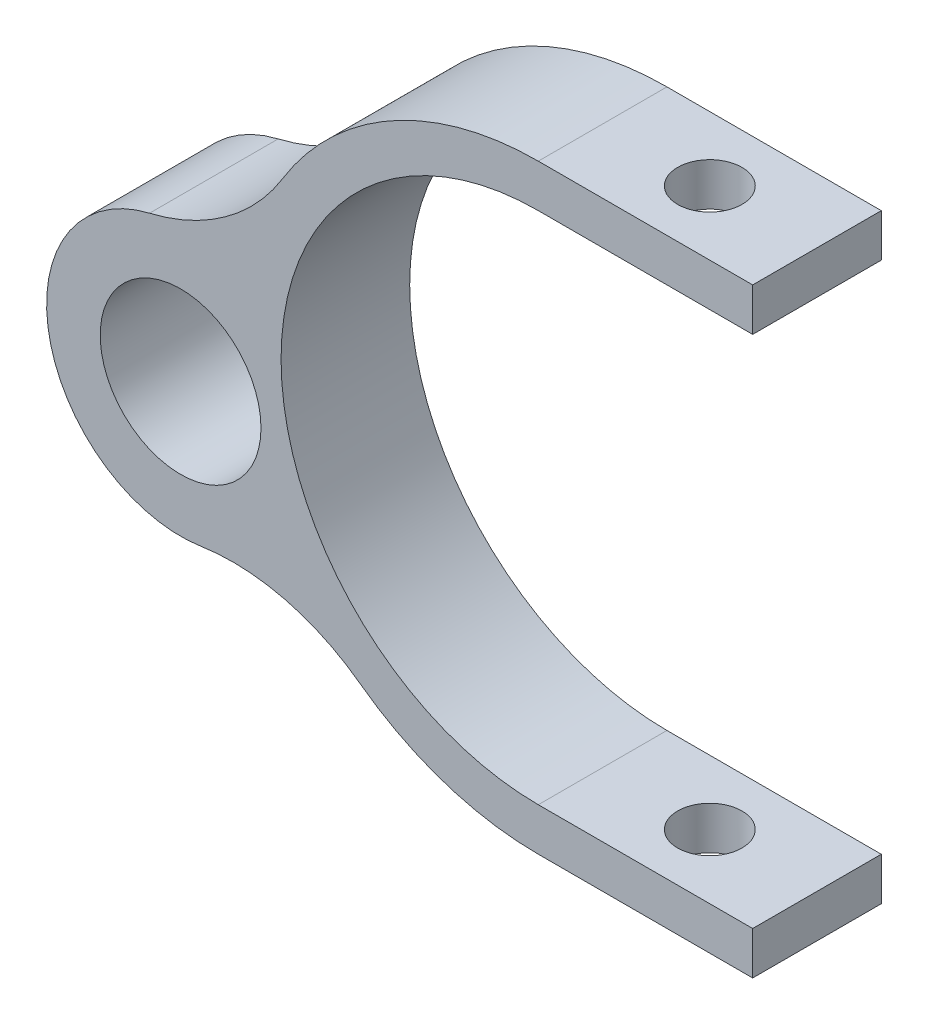
ISO-10303-21;
HEADER;
FILE_DESCRIPTION(('STEP AP214'),'2;1');
FILE_NAME('part.step','',(''),(''),'','','');
FILE_SCHEMA(('AUTOMOTIVE_DESIGN { 1 0 10303 214 1 1 1 1 }'));
ENDSEC;
DATA;
#1=APPLICATION_CONTEXT('core data for automotive mechanical design processes');
#2=APPLICATION_PROTOCOL_DEFINITION('international standard','automotive_design',2000,#1);
#3=PRODUCT_CONTEXT('',#1,'mechanical');
#4=PRODUCT('Part','Part','',(#3));
#5=PRODUCT_RELATED_PRODUCT_CATEGORY('part','',(#4));
#6=PRODUCT_DEFINITION_FORMATION('','',#4);
#7=PRODUCT_DEFINITION_CONTEXT('part definition',#1,'design');
#8=PRODUCT_DEFINITION('design','',#6,#7);
#9=PRODUCT_DEFINITION_SHAPE('','',#8);
#10=(LENGTH_UNIT() NAMED_UNIT(*) SI_UNIT(.MILLI.,.METRE.));
#11=(NAMED_UNIT(*) PLANE_ANGLE_UNIT() SI_UNIT($,.RADIAN.));
#12=(NAMED_UNIT(*) SI_UNIT($,.STERADIAN.) SOLID_ANGLE_UNIT());
#13=UNCERTAINTY_MEASURE_WITH_UNIT(LENGTH_MEASURE(1.E-05),#10,'distance_accuracy_value','');
#14=(GEOMETRIC_REPRESENTATION_CONTEXT(3) GLOBAL_UNCERTAINTY_ASSIGNED_CONTEXT((#13)) GLOBAL_UNIT_ASSIGNED_CONTEXT((#10,
#11,#12)) REPRESENTATION_CONTEXT('',''));
#15=CARTESIAN_POINT('',(0.,0.,0.));
#16=DIRECTION('',(0.,0.,1.));
#17=DIRECTION('',(1.,0.,0.));
#18=AXIS2_PLACEMENT_3D('',#15,#16,#17);
#19=CARTESIAN_POINT('',(0.,0.,6.));
#20=DIRECTION('',(0.,0.,1.));
#21=DIRECTION('',(1.,0.,0.));
#22=AXIS2_PLACEMENT_3D('',#19,#20,#21);
#23=PLANE('',#22);
#24=CARTESIAN_POINT('',(0.,0.,6.));
#25=DIRECTION('',(0.,0.,-1.));
#26=DIRECTION('',(1.,0.,0.));
#27=AXIS2_PLACEMENT_3D('',#24,#25,#26);
#28=CIRCLE('',#27,12.);
#29=CARTESIAN_POINT('',(0.,-12.,6.));
#30=VERTEX_POINT('',#29);
#31=CARTESIAN_POINT('',(0.,12.,6.));
#32=VERTEX_POINT('',#31);
#33=EDGE_CURVE('E133',#30,#32,#28,.T.);
#34=ORIENTED_EDGE('',*,*,#33,.T.);
#35=DIRECTION('',(1.,0.,0.));
#36=VECTOR('',#35,1.);
#37=CARTESIAN_POINT('',(0.,12.,6.));
#38=LINE('',#37,#36);
#39=CARTESIAN_POINT('',(10.,12.,6.));
#40=VERTEX_POINT('',#39);
#41=EDGE_CURVE('E122',#32,#40,#38,.T.);
#42=ORIENTED_EDGE('',*,*,#41,.T.);
#43=DIRECTION('',(0.,1.,0.));
#44=VECTOR('',#43,1.);
#45=CARTESIAN_POINT('',(10.,12.,6.));
#46=LINE('',#45,#44);
#47=CARTESIAN_POINT('',(10.,14.,6.));
#48=VERTEX_POINT('',#47);
#49=EDGE_CURVE('E132',#40,#48,#46,.T.);
#50=ORIENTED_EDGE('',*,*,#49,.T.);
#51=DIRECTION('',(-1.,0.,0.));
#52=VECTOR('',#51,1.);
#53=CARTESIAN_POINT('',(10.,14.,6.));
#54=LINE('',#53,#52);
#55=CARTESIAN_POINT('',(0.,14.,6.));
#56=VERTEX_POINT('',#55);
#57=EDGE_CURVE('E227',#48,#56,#54,.T.);
#58=ORIENTED_EDGE('',*,*,#57,.T.);
#59=CARTESIAN_POINT('',(0.,0.,6.));
#60=DIRECTION('',(0.,0.,1.));
#61=DIRECTION('',(1.,0.,0.));
#62=AXIS2_PLACEMENT_3D('',#59,#60,#61);
#63=CIRCLE('',#62,14.);
#64=CARTESIAN_POINT('',(-11.9306627962766,7.32524984157825,6.));
#65=VERTEX_POINT('',#64);
#66=EDGE_CURVE('E242',#56,#65,#63,.T.);
#67=ORIENTED_EDGE('',*,*,#66,.T.);
#68=CARTESIAN_POINT('',(-20.452564793617,12.5575711569913,6.));
#69=DIRECTION('',(0.,0.,1.));
#70=DIRECTION('',(1.,0.,0.));
#71=AXIS2_PLACEMENT_3D('',#68,#69,#70);
#72=CIRCLE('',#71,10.);
#73=CARTESIAN_POINT('',(-18.1349552332559,2.82984347136383,6.));
#74=VERTEX_POINT('',#73);
#75=EDGE_CURVE('E11',#65,#74,#72,.F.);
#76=ORIENTED_EDGE('',*,*,#75,.T.);
#77=CARTESIAN_POINT('',(-16.6864492580302,-3.24998633215332,6.));
#78=DIRECTION('',(0.,0.,1.));
#79=DIRECTION('',(1.,0.,0.));
#80=AXIS2_PLACEMENT_3D('',#77,#78,#79);
#81=CIRCLE('',#80,6.25);
#82=CARTESIAN_POINT('',(-15.7473196866587,-9.42902635857941,6.));
#83=VERTEX_POINT('',#82);
#84=EDGE_CURVE('E175',#74,#83,#81,.T.);
#85=ORIENTED_EDGE('',*,*,#84,.T.);
#86=CARTESIAN_POINT('',(-14.2447123724644,-19.3154904008611,6.));
#87=DIRECTION('',(0.,0.,1.));
#88=DIRECTION('',(1.,0.,0.));
#89=AXIS2_PLACEMENT_3D('',#86,#87,#88);
#90=CIRCLE('',#89,10.);
#91=CARTESIAN_POINT('',(-8.30941555060424,-11.2673694005023,6.));
#92=VERTEX_POINT('',#91);
#93=EDGE_CURVE('E168',#83,#92,#90,.F.);
#94=ORIENTED_EDGE('',*,*,#93,.T.);
#95=CARTESIAN_POINT('',(0.,0.,6.));
#96=DIRECTION('',(0.,0.,1.));
#97=DIRECTION('',(1.,0.,0.));
#98=AXIS2_PLACEMENT_3D('',#95,#96,#97);
#99=CIRCLE('',#98,14.);
#100=CARTESIAN_POINT('',(0.,-14.,6.));
#101=VERTEX_POINT('',#100);
#102=EDGE_CURVE('E172',#92,#101,#99,.T.);
#103=ORIENTED_EDGE('',*,*,#102,.T.);
#104=DIRECTION('',(1.,0.,0.));
#105=VECTOR('',#104,1.);
#106=CARTESIAN_POINT('',(0.,-14.,6.));
#107=LINE('',#106,#105);
#108=CARTESIAN_POINT('',(10.,-14.,6.));
#109=VERTEX_POINT('',#108);
#110=EDGE_CURVE('E185',#101,#109,#107,.T.);
#111=ORIENTED_EDGE('',*,*,#110,.T.);
#112=DIRECTION('',(0.,1.,0.));
#113=VECTOR('',#112,1.);
#114=CARTESIAN_POINT('',(10.,-14.,6.));
#115=LINE('',#114,#113);
#116=CARTESIAN_POINT('',(10.,-12.,6.));
#117=VERTEX_POINT('',#116);
#118=EDGE_CURVE('E238',#109,#117,#115,.T.);
#119=ORIENTED_EDGE('',*,*,#118,.T.);
#120=DIRECTION('',(-1.,0.,0.));
#121=VECTOR('',#120,1.);
#122=CARTESIAN_POINT('',(0.,-12.,6.));
#123=LINE('',#122,#121);
#124=EDGE_CURVE('E138',#117,#30,#123,.T.);
#125=ORIENTED_EDGE('',*,*,#124,.T.);
#126=EDGE_LOOP('',(#34,#42,#50,#58,#67,#76,#85,#94,#103,#111,#119,#125));
#127=FACE_BOUND('',#126,.T.);
#128=CARTESIAN_POINT('',(-16.6864492580302,-3.24998633215332,6.));
#129=DIRECTION('',(0.,0.,1.));
#130=DIRECTION('',(1.,0.,0.));
#131=AXIS2_PLACEMENT_3D('',#128,#129,#130);
#132=CIRCLE('',#131,3.75);
#133=CARTESIAN_POINT('',(-12.9364492580302,-3.24998633215332,6.));
#134=VERTEX_POINT('',#133);
#135=EDGE_CURVE('E236',#134,#134,#132,.T.);
#136=ORIENTED_EDGE('',*,*,#135,.F.);
#137=EDGE_LOOP('',(#136));
#138=FACE_BOUND('',#137,.T.);
#139=ADVANCED_FACE('F33',(#127,#138),#23,.T.);
#140=CARTESIAN_POINT('',(0.,0.,0.));
#141=DIRECTION('',(0.,0.,1.));
#142=DIRECTION('',(1.,0.,0.));
#143=AXIS2_PLACEMENT_3D('',#140,#141,#142);
#144=PLANE('',#143);
#145=CARTESIAN_POINT('',(0.,0.,0.));
#146=DIRECTION('',(0.,0.,-1.));
#147=DIRECTION('',(1.,0.,0.));
#148=AXIS2_PLACEMENT_3D('',#145,#146,#147);
#149=CIRCLE('',#148,12.);
#150=CARTESIAN_POINT('',(0.,-12.,0.));
#151=VERTEX_POINT('',#150);
#152=CARTESIAN_POINT('',(0.,12.,0.));
#153=VERTEX_POINT('',#152);
#154=EDGE_CURVE('E146',#151,#153,#149,.T.);
#155=ORIENTED_EDGE('',*,*,#154,.F.);
#156=DIRECTION('',(-1.,0.,0.));
#157=VECTOR('',#156,1.);
#158=CARTESIAN_POINT('',(0.,-12.,0.));
#159=LINE('',#158,#157);
#160=CARTESIAN_POINT('',(10.,-12.,0.));
#161=VERTEX_POINT('',#160);
#162=EDGE_CURVE('E142',#161,#151,#159,.T.);
#163=ORIENTED_EDGE('',*,*,#162,.F.);
#164=DIRECTION('',(0.,1.,0.));
#165=VECTOR('',#164,1.);
#166=CARTESIAN_POINT('',(10.,-14.,0.));
#167=LINE('',#166,#165);
#168=CARTESIAN_POINT('',(10.,-14.,0.));
#169=VERTEX_POINT('',#168);
#170=EDGE_CURVE('E206',#169,#161,#167,.T.);
#171=ORIENTED_EDGE('',*,*,#170,.F.);
#172=DIRECTION('',(1.,0.,0.));
#173=VECTOR('',#172,1.);
#174=CARTESIAN_POINT('',(0.,-14.,0.));
#175=LINE('',#174,#173);
#176=CARTESIAN_POINT('',(0.,-14.,0.));
#177=VERTEX_POINT('',#176);
#178=EDGE_CURVE('E199',#177,#169,#175,.T.);
#179=ORIENTED_EDGE('',*,*,#178,.F.);
#180=CARTESIAN_POINT('',(0.,0.,0.));
#181=DIRECTION('',(0.,0.,1.));
#182=DIRECTION('',(1.,0.,0.));
#183=AXIS2_PLACEMENT_3D('',#180,#181,#182);
#184=CIRCLE('',#183,14.);
#185=CARTESIAN_POINT('',(-8.30941555060424,-11.2673694005023,0.));
#186=VERTEX_POINT('',#185);
#187=EDGE_CURVE('E193',#186,#177,#184,.T.);
#188=ORIENTED_EDGE('',*,*,#187,.F.);
#189=CARTESIAN_POINT('',(-14.2447123724644,-19.3154904008611,0.));
#190=DIRECTION('',(0.,0.,1.));
#191=DIRECTION('',(1.,0.,0.));
#192=AXIS2_PLACEMENT_3D('',#189,#190,#191);
#193=CIRCLE('',#192,10.);
#194=CARTESIAN_POINT('',(-15.7473196866587,-9.42902635857941,0.));
#195=VERTEX_POINT('',#194);
#196=EDGE_CURVE('E166',#186,#195,#193,.T.);
#197=ORIENTED_EDGE('',*,*,#196,.T.);
#198=CARTESIAN_POINT('',(-16.6864492580302,-3.24998633215332,0.));
#199=DIRECTION('',(0.,0.,1.));
#200=DIRECTION('',(1.,0.,0.));
#201=AXIS2_PLACEMENT_3D('',#198,#199,#200);
#202=CIRCLE('',#201,6.25);
#203=CARTESIAN_POINT('',(-18.1349552332559,2.82984347136383,0.));
#204=VERTEX_POINT('',#203);
#205=EDGE_CURVE('E191',#204,#195,#202,.T.);
#206=ORIENTED_EDGE('',*,*,#205,.F.);
#207=CARTESIAN_POINT('',(-20.452564793617,12.5575711569913,0.));
#208=DIRECTION('',(0.,0.,1.));
#209=DIRECTION('',(1.,0.,0.));
#210=AXIS2_PLACEMENT_3D('',#207,#208,#209);
#211=CIRCLE('',#210,10.);
#212=CARTESIAN_POINT('',(-11.9306627962766,7.32524984157825,0.));
#213=VERTEX_POINT('',#212);
#214=EDGE_CURVE('E41',#204,#213,#211,.T.);
#215=ORIENTED_EDGE('',*,*,#214,.T.);
#216=CARTESIAN_POINT('',(0.,0.,0.));
#217=DIRECTION('',(0.,0.,1.));
#218=DIRECTION('',(1.,0.,0.));
#219=AXIS2_PLACEMENT_3D('',#216,#217,#218);
#220=CIRCLE('',#219,14.);
#221=CARTESIAN_POINT('',(0.,14.,0.));
#222=VERTEX_POINT('',#221);
#223=EDGE_CURVE('E197',#222,#213,#220,.T.);
#224=ORIENTED_EDGE('',*,*,#223,.F.);
#225=DIRECTION('',(-1.,0.,0.));
#226=VECTOR('',#225,1.);
#227=CARTESIAN_POINT('',(10.,14.,0.));
#228=LINE('',#227,#226);
#229=CARTESIAN_POINT('',(10.,14.,0.));
#230=VERTEX_POINT('',#229);
#231=EDGE_CURVE('E201',#230,#222,#228,.T.);
#232=ORIENTED_EDGE('',*,*,#231,.F.);
#233=DIRECTION('',(0.,1.,0.));
#234=VECTOR('',#233,1.);
#235=CARTESIAN_POINT('',(10.,12.,0.));
#236=LINE('',#235,#234);
#237=CARTESIAN_POINT('',(10.,12.,0.));
#238=VERTEX_POINT('',#237);
#239=EDGE_CURVE('E230',#238,#230,#236,.T.);
#240=ORIENTED_EDGE('',*,*,#239,.F.);
#241=DIRECTION('',(1.,0.,0.));
#242=VECTOR('',#241,1.);
#243=CARTESIAN_POINT('',(0.,12.,0.));
#244=LINE('',#243,#242);
#245=EDGE_CURVE('E231',#153,#238,#244,.T.);
#246=ORIENTED_EDGE('',*,*,#245,.F.);
#247=EDGE_LOOP('',(#155,#163,#171,#179,#188,#197,#206,#215,#224,#232,#240,#246));
#248=FACE_BOUND('',#247,.T.);
#249=CARTESIAN_POINT('',(-16.6864492580302,-3.24998633215332,0.));
#250=DIRECTION('',(0.,0.,1.));
#251=DIRECTION('',(1.,0.,0.));
#252=AXIS2_PLACEMENT_3D('',#249,#250,#251);
#253=CIRCLE('',#252,3.75);
#254=CARTESIAN_POINT('',(-12.9364492580302,-3.24998633215332,0.));
#255=VERTEX_POINT('',#254);
#256=EDGE_CURVE('E246',#255,#255,#253,.T.);
#257=ORIENTED_EDGE('',*,*,#256,.T.);
#258=EDGE_LOOP('',(#257));
#259=FACE_BOUND('',#258,.T.);
#260=ADVANCED_FACE('F189',(#248,#259),#144,.F.);
#261=CARTESIAN_POINT('',(0.,0.,6.));
#262=DIRECTION('',(0.,0.,-1.));
#263=DIRECTION('',(-1.,0.,0.));
#264=AXIS2_PLACEMENT_3D('',#261,#262,#263);
#265=CYLINDRICAL_SURFACE('',#264,12.);
#266=ORIENTED_EDGE('',*,*,#154,.T.);
#267=DIRECTION('',(0.,0.,-1.));
#268=VECTOR('',#267,1.);
#269=CARTESIAN_POINT('',(0.,12.,6.));
#270=LINE('',#269,#268);
#271=EDGE_CURVE('E126',#32,#153,#270,.T.);
#272=ORIENTED_EDGE('',*,*,#271,.F.);
#273=ORIENTED_EDGE('',*,*,#33,.F.);
#274=DIRECTION('',(0.,0.,-1.));
#275=VECTOR('',#274,1.);
#276=CARTESIAN_POINT('',(0.,-12.,6.));
#277=LINE('',#276,#275);
#278=EDGE_CURVE('E209',#30,#151,#277,.T.);
#279=ORIENTED_EDGE('',*,*,#278,.T.);
#280=EDGE_LOOP('',(#266,#272,#273,#279));
#281=FACE_BOUND('',#280,.T.);
#282=ADVANCED_FACE('F144',(#281),#265,.F.);
#283=CARTESIAN_POINT('',(0.,12.,6.));
#284=DIRECTION('',(0.,1.,0.));
#285=DIRECTION('',(0.,0.,1.));
#286=AXIS2_PLACEMENT_3D('',#283,#284,#285);
#287=PLANE('',#286);
#288=CARTESIAN_POINT('',(5.,12.,3.));
#289=DIRECTION('',(0.,1.,0.));
#290=DIRECTION('',(0.,0.,1.));
#291=AXIS2_PLACEMENT_3D('',#288,#289,#290);
#292=CIRCLE('',#291,1.5);
#293=CARTESIAN_POINT('',(5.,12.,4.5));
#294=VERTEX_POINT('',#293);
#295=EDGE_CURVE('E249',#294,#294,#292,.T.);
#296=ORIENTED_EDGE('',*,*,#295,.T.);
#297=EDGE_LOOP('',(#296));
#298=FACE_BOUND('',#297,.T.);
#299=ORIENTED_EDGE('',*,*,#245,.T.);
#300=DIRECTION('',(0.,0.,-1.));
#301=VECTOR('',#300,1.);
#302=CARTESIAN_POINT('',(10.,12.,6.));
#303=LINE('',#302,#301);
#304=EDGE_CURVE('E129',#40,#238,#303,.T.);
#305=ORIENTED_EDGE('',*,*,#304,.F.);
#306=ORIENTED_EDGE('',*,*,#41,.F.);
#307=ORIENTED_EDGE('',*,*,#271,.T.);
#308=EDGE_LOOP('',(#299,#305,#306,#307));
#309=FACE_BOUND('',#308,.T.);
#310=ADVANCED_FACE('F124',(#298,#309),#287,.F.);
#311=CARTESIAN_POINT('',(10.,12.,6.));
#312=DIRECTION('',(-1.,0.,0.));
#313=DIRECTION('',(0.,0.,1.));
#314=AXIS2_PLACEMENT_3D('',#311,#312,#313);
#315=PLANE('',#314);
#316=ORIENTED_EDGE('',*,*,#239,.T.);
#317=DIRECTION('',(0.,0.,-1.));
#318=VECTOR('',#317,1.);
#319=CARTESIAN_POINT('',(10.,14.,6.));
#320=LINE('',#319,#318);
#321=EDGE_CURVE('E152',#48,#230,#320,.T.);
#322=ORIENTED_EDGE('',*,*,#321,.F.);
#323=ORIENTED_EDGE('',*,*,#49,.F.);
#324=ORIENTED_EDGE('',*,*,#304,.T.);
#325=EDGE_LOOP('',(#316,#322,#323,#324));
#326=FACE_BOUND('',#325,.T.);
#327=ADVANCED_FACE('F264',(#326),#315,.F.);
#328=CARTESIAN_POINT('',(10.,14.,6.));
#329=DIRECTION('',(0.,-1.,0.));
#330=DIRECTION('',(1.,0.,0.));
#331=AXIS2_PLACEMENT_3D('',#328,#329,#330);
#332=PLANE('',#331);
#333=CARTESIAN_POINT('',(5.,14.,3.));
#334=DIRECTION('',(0.,1.,0.));
#335=DIRECTION('',(-1.,0.,0.));
#336=AXIS2_PLACEMENT_3D('',#333,#334,#335);
#337=CIRCLE('',#336,1.5);
#338=CARTESIAN_POINT('',(3.5,14.,3.));
#339=VERTEX_POINT('',#338);
#340=EDGE_CURVE('E159',#339,#339,#337,.T.);
#341=ORIENTED_EDGE('',*,*,#340,.F.);
#342=EDGE_LOOP('',(#341));
#343=FACE_BOUND('',#342,.T.);
#344=ORIENTED_EDGE('',*,*,#231,.T.);
#345=DIRECTION('',(0.,0.,-1.));
#346=VECTOR('',#345,1.);
#347=CARTESIAN_POINT('',(0.,14.,6.));
#348=LINE('',#347,#346);
#349=EDGE_CURVE('E218',#56,#222,#348,.T.);
#350=ORIENTED_EDGE('',*,*,#349,.F.);
#351=ORIENTED_EDGE('',*,*,#57,.F.);
#352=ORIENTED_EDGE('',*,*,#321,.T.);
#353=EDGE_LOOP('',(#344,#350,#351,#352));
#354=FACE_BOUND('',#353,.T.);
#355=ADVANCED_FACE('F225',(#343,#354),#332,.F.);
#356=CARTESIAN_POINT('',(0.,0.,6.));
#357=DIRECTION('',(0.,0.,-1.));
#358=DIRECTION('',(-1.,0.,0.));
#359=AXIS2_PLACEMENT_3D('',#356,#357,#358);
#360=CYLINDRICAL_SURFACE('',#359,14.);
#361=ORIENTED_EDGE('',*,*,#223,.T.);
#362=DIRECTION('',(0.,0.,-1.));
#363=VECTOR('',#362,1.);
#364=CARTESIAN_POINT('',(-11.9306627962766,7.32524984157825,6.));
#365=LINE('',#364,#363);
#366=EDGE_CURVE('E48',#213,#65,#365,.F.);
#367=ORIENTED_EDGE('',*,*,#366,.T.);
#368=ORIENTED_EDGE('',*,*,#66,.F.);
#369=ORIENTED_EDGE('',*,*,#349,.T.);
#370=EDGE_LOOP('',(#361,#367,#368,#369));
#371=FACE_BOUND('',#370,.T.);
#372=ADVANCED_FACE('F263',(#371),#360,.T.);
#373=CARTESIAN_POINT('',(-16.6864492580302,-3.24998633215332,6.));
#374=DIRECTION('',(0.,0.,-1.));
#375=DIRECTION('',(-1.,0.,0.));
#376=AXIS2_PLACEMENT_3D('',#373,#374,#375);
#377=CYLINDRICAL_SURFACE('',#376,6.25);
#378=ORIENTED_EDGE('',*,*,#205,.T.);
#379=DIRECTION('',(0.,0.,-1.));
#380=VECTOR('',#379,1.);
#381=CARTESIAN_POINT('',(-15.7473196866587,-9.42902635857941,6.));
#382=LINE('',#381,#380);
#383=EDGE_CURVE('E163',#195,#83,#382,.F.);
#384=ORIENTED_EDGE('',*,*,#383,.T.);
#385=ORIENTED_EDGE('',*,*,#84,.F.);
#386=DIRECTION('',(0.,0.,-1.));
#387=VECTOR('',#386,1.);
#388=CARTESIAN_POINT('',(-18.1349552332559,2.82984347136384,6.));
#389=LINE('',#388,#387);
#390=EDGE_CURVE('E150',#74,#204,#389,.T.);
#391=ORIENTED_EDGE('',*,*,#390,.T.);
#392=EDGE_LOOP('',(#378,#384,#385,#391));
#393=FACE_BOUND('',#392,.T.);
#394=ADVANCED_FACE('F195',(#393),#377,.T.);
#395=CARTESIAN_POINT('',(0.,0.,6.));
#396=DIRECTION('',(0.,0.,-1.));
#397=DIRECTION('',(-1.,0.,0.));
#398=AXIS2_PLACEMENT_3D('',#395,#396,#397);
#399=CYLINDRICAL_SURFACE('',#398,14.);
#400=ORIENTED_EDGE('',*,*,#102,.F.);
#401=DIRECTION('',(0.,0.,-1.));
#402=VECTOR('',#401,1.);
#403=CARTESIAN_POINT('',(-8.30941555060424,-11.2673694005023,6.));
#404=LINE('',#403,#402);
#405=EDGE_CURVE('E147',#92,#186,#404,.T.);
#406=ORIENTED_EDGE('',*,*,#405,.T.);
#407=ORIENTED_EDGE('',*,*,#187,.T.);
#408=DIRECTION('',(0.,0.,-1.));
#409=VECTOR('',#408,1.);
#410=CARTESIAN_POINT('',(0.,-14.,6.));
#411=LINE('',#410,#409);
#412=EDGE_CURVE('E183',#101,#177,#411,.T.);
#413=ORIENTED_EDGE('',*,*,#412,.F.);
#414=EDGE_LOOP('',(#400,#406,#407,#413));
#415=FACE_BOUND('',#414,.T.);
#416=ADVANCED_FACE('F180',(#415),#399,.T.);
#417=CARTESIAN_POINT('',(0.,-14.,6.));
#418=DIRECTION('',(0.,1.,0.));
#419=DIRECTION('',(-1.,0.,0.));
#420=AXIS2_PLACEMENT_3D('',#417,#418,#419);
#421=PLANE('',#420);
#422=CARTESIAN_POINT('',(5.,-14.,3.));
#423=DIRECTION('',(0.,1.,0.));
#424=DIRECTION('',(-1.,0.,0.));
#425=AXIS2_PLACEMENT_3D('',#422,#423,#424);
#426=CIRCLE('',#425,1.5);
#427=CARTESIAN_POINT('',(3.5,-14.,3.));
#428=VERTEX_POINT('',#427);
#429=EDGE_CURVE('E158',#428,#428,#426,.T.);
#430=ORIENTED_EDGE('',*,*,#429,.T.);
#431=EDGE_LOOP('',(#430));
#432=FACE_BOUND('',#431,.T.);
#433=ORIENTED_EDGE('',*,*,#178,.T.);
#434=DIRECTION('',(0.,0.,-1.));
#435=VECTOR('',#434,1.);
#436=CARTESIAN_POINT('',(10.,-14.,6.));
#437=LINE('',#436,#435);
#438=EDGE_CURVE('E214',#109,#169,#437,.T.);
#439=ORIENTED_EDGE('',*,*,#438,.F.);
#440=ORIENTED_EDGE('',*,*,#110,.F.);
#441=ORIENTED_EDGE('',*,*,#412,.T.);
#442=EDGE_LOOP('',(#433,#439,#440,#441));
#443=FACE_BOUND('',#442,.T.);
#444=ADVANCED_FACE('F289',(#432,#443),#421,.F.);
#445=CARTESIAN_POINT('',(10.,-14.,6.));
#446=DIRECTION('',(-1.,0.,0.));
#447=DIRECTION('',(0.,0.,1.));
#448=AXIS2_PLACEMENT_3D('',#445,#446,#447);
#449=PLANE('',#448);
#450=ORIENTED_EDGE('',*,*,#170,.T.);
#451=DIRECTION('',(0.,0.,-1.));
#452=VECTOR('',#451,1.);
#453=CARTESIAN_POINT('',(10.,-12.,6.));
#454=LINE('',#453,#452);
#455=EDGE_CURVE('E211',#117,#161,#454,.T.);
#456=ORIENTED_EDGE('',*,*,#455,.F.);
#457=ORIENTED_EDGE('',*,*,#118,.F.);
#458=ORIENTED_EDGE('',*,*,#438,.T.);
#459=EDGE_LOOP('',(#450,#456,#457,#458));
#460=FACE_BOUND('',#459,.T.);
#461=ADVANCED_FACE('F285',(#460),#449,.F.);
#462=CARTESIAN_POINT('',(0.,-12.,6.));
#463=DIRECTION('',(0.,-1.,0.));
#464=DIRECTION('',(1.,0.,0.));
#465=AXIS2_PLACEMENT_3D('',#462,#463,#464);
#466=PLANE('',#465);
#467=CARTESIAN_POINT('',(5.,-12.,3.));
#468=DIRECTION('',(0.,-1.,0.));
#469=DIRECTION('',(1.,0.,0.));
#470=AXIS2_PLACEMENT_3D('',#467,#468,#469);
#471=CIRCLE('',#470,1.5);
#472=CARTESIAN_POINT('',(6.5,-12.,3.));
#473=VERTEX_POINT('',#472);
#474=EDGE_CURVE('E156',#473,#473,#471,.T.);
#475=ORIENTED_EDGE('',*,*,#474,.T.);
#476=EDGE_LOOP('',(#475));
#477=FACE_BOUND('',#476,.T.);
#478=ORIENTED_EDGE('',*,*,#162,.T.);
#479=ORIENTED_EDGE('',*,*,#278,.F.);
#480=ORIENTED_EDGE('',*,*,#124,.F.);
#481=ORIENTED_EDGE('',*,*,#455,.T.);
#482=EDGE_LOOP('',(#478,#479,#480,#481));
#483=FACE_BOUND('',#482,.T.);
#484=ADVANCED_FACE('F282',(#477,#483),#466,.F.);
#485=CARTESIAN_POINT('',(-16.6864492580302,-3.24998633215332,6.));
#486=DIRECTION('',(0.,0.,-1.));
#487=DIRECTION('',(-1.,0.,0.));
#488=AXIS2_PLACEMENT_3D('',#485,#486,#487);
#489=CYLINDRICAL_SURFACE('',#488,3.75);
#490=ORIENTED_EDGE('',*,*,#135,.T.);
#491=EDGE_LOOP('',(#490));
#492=FACE_BOUND('',#491,.T.);
#493=ORIENTED_EDGE('',*,*,#256,.F.);
#494=EDGE_LOOP('',(#493));
#495=FACE_BOUND('',#494,.T.);
#496=ADVANCED_FACE('F279',(#492,#495),#489,.F.);
#497=CARTESIAN_POINT('',(5.00000000000001,-25.,3.));
#498=DIRECTION('',(0.,1.,0.));
#499=DIRECTION('',(-1.,0.,0.));
#500=AXIS2_PLACEMENT_3D('',#497,#498,#499);
#501=CYLINDRICAL_SURFACE('',#500,1.5);
#502=ORIENTED_EDGE('',*,*,#474,.F.);
#503=EDGE_LOOP('',(#502));
#504=FACE_BOUND('',#503,.T.);
#505=ORIENTED_EDGE('',*,*,#429,.F.);
#506=EDGE_LOOP('',(#505));
#507=FACE_BOUND('',#506,.T.);
#508=ADVANCED_FACE('F326',(#504,#507),#501,.F.);
#509=ORIENTED_EDGE('',*,*,#340,.T.);
#510=EDGE_LOOP('',(#509));
#511=FACE_BOUND('',#510,.T.);
#512=ORIENTED_EDGE('',*,*,#295,.F.);
#513=EDGE_LOOP('',(#512));
#514=FACE_BOUND('',#513,.T.);
#515=ADVANCED_FACE('F259',(#511,#514),#501,.F.);
#516=CARTESIAN_POINT('',(-14.2447123724644,-19.3154904008611,6.));
#517=DIRECTION('',(0.,0.,1.));
#518=DIRECTION('',(1.,0.,0.));
#519=AXIS2_PLACEMENT_3D('',#516,#517,#518);
#520=CYLINDRICAL_SURFACE('',#519,10.);
#521=ORIENTED_EDGE('',*,*,#93,.F.);
#522=ORIENTED_EDGE('',*,*,#383,.F.);
#523=ORIENTED_EDGE('',*,*,#196,.F.);
#524=ORIENTED_EDGE('',*,*,#405,.F.);
#525=EDGE_LOOP('',(#521,#522,#523,#524));
#526=FACE_BOUND('',#525,.T.);
#527=ADVANCED_FACE('F187',(#526),#520,.F.);
#528=CARTESIAN_POINT('',(-20.452564793617,12.5575711569913,6.));
#529=DIRECTION('',(0.,0.,1.));
#530=DIRECTION('',(1.,0.,0.));
#531=AXIS2_PLACEMENT_3D('',#528,#529,#530);
#532=CYLINDRICAL_SURFACE('',#531,10.);
#533=ORIENTED_EDGE('',*,*,#75,.F.);
#534=ORIENTED_EDGE('',*,*,#366,.F.);
#535=ORIENTED_EDGE('',*,*,#214,.F.);
#536=ORIENTED_EDGE('',*,*,#390,.F.);
#537=EDGE_LOOP('',(#533,#534,#535,#536));
#538=FACE_BOUND('',#537,.T.);
#539=ADVANCED_FACE('F35',(#538),#532,.F.);
#540=CLOSED_SHELL('',(#139,#260,#282,#310,#327,#355,#372,#394,#416,#444,#461,#484,#496,#508,
#515,#527,#539));
#541=MANIFOLD_SOLID_BREP('B2',#540);
#542=ADVANCED_BREP_SHAPE_REPRESENTATION('',(#18,#541),#14);
#543=SHAPE_DEFINITION_REPRESENTATION(#9,#542);
ENDSEC;
END-ISO-10303-21;
